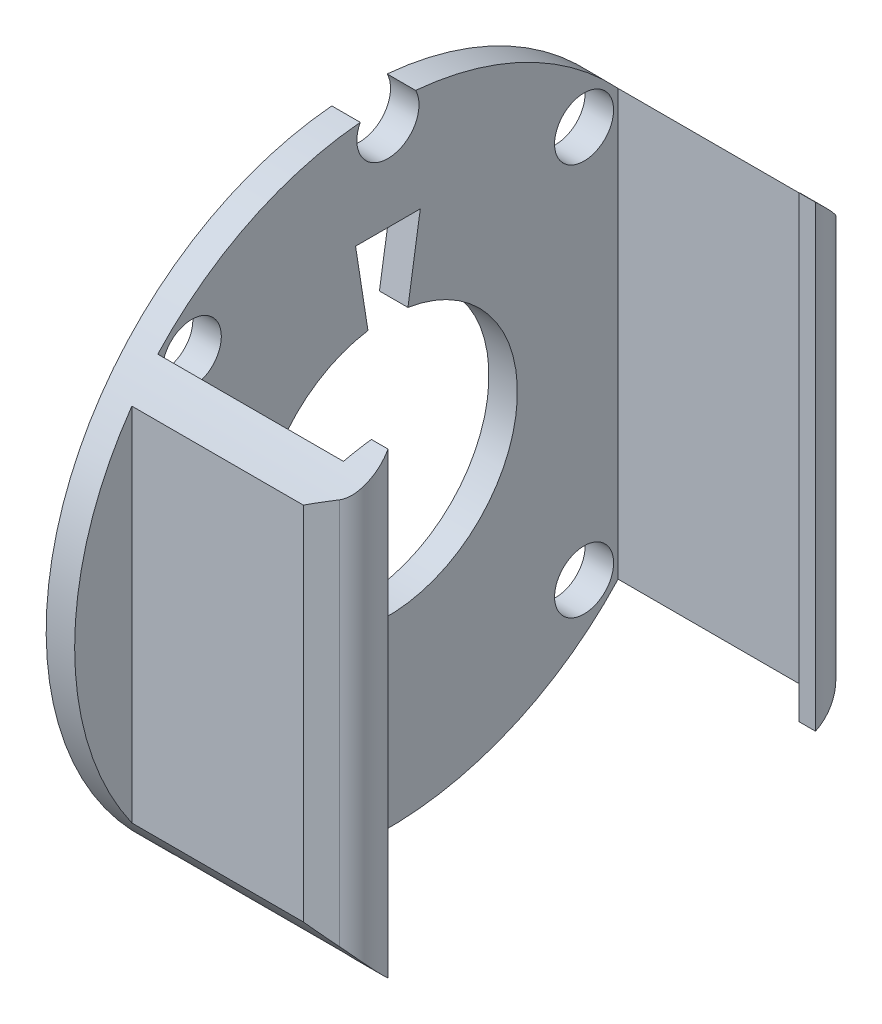
ISO-10303-21;
HEADER;
FILE_DESCRIPTION(('STEP AP214'),'2;1');
FILE_NAME('part.step','',(''),(''),'','','');
FILE_SCHEMA(('AUTOMOTIVE_DESIGN { 1 0 10303 214 1 1 1 1 }'));
ENDSEC;
DATA;
#1=APPLICATION_CONTEXT('core data for automotive mechanical design processes');
#2=APPLICATION_PROTOCOL_DEFINITION('international standard','automotive_design',2000,#1);
#3=PRODUCT_CONTEXT('',#1,'mechanical');
#4=PRODUCT('Part','Part','',(#3));
#5=PRODUCT_RELATED_PRODUCT_CATEGORY('part','',(#4));
#6=PRODUCT_DEFINITION_FORMATION('','',#4);
#7=PRODUCT_DEFINITION_CONTEXT('part definition',#1,'design');
#8=PRODUCT_DEFINITION('design','',#6,#7);
#9=PRODUCT_DEFINITION_SHAPE('','',#8);
#10=(LENGTH_UNIT() NAMED_UNIT(*) SI_UNIT(.MILLI.,.METRE.));
#11=(NAMED_UNIT(*) PLANE_ANGLE_UNIT() SI_UNIT($,.RADIAN.));
#12=(NAMED_UNIT(*) SI_UNIT($,.STERADIAN.) SOLID_ANGLE_UNIT());
#13=UNCERTAINTY_MEASURE_WITH_UNIT(LENGTH_MEASURE(1.E-05),#10,'distance_accuracy_value','');
#14=(GEOMETRIC_REPRESENTATION_CONTEXT(3) GLOBAL_UNCERTAINTY_ASSIGNED_CONTEXT((#13)) GLOBAL_UNIT_ASSIGNED_CONTEXT((#10,
#11,#12)) REPRESENTATION_CONTEXT('',''));
#15=CARTESIAN_POINT('',(0.,0.,0.));
#16=DIRECTION('',(0.,0.,1.));
#17=DIRECTION('',(1.,0.,0.));
#18=AXIS2_PLACEMENT_3D('',#15,#16,#17);
#19=CARTESIAN_POINT('',(5.5,0.,0.));
#20=DIRECTION('',(1.,0.,0.));
#21=DIRECTION('',(0.,0.,-1.));
#22=AXIS2_PLACEMENT_3D('',#19,#20,#21);
#23=PLANE('',#22);
#24=CARTESIAN_POINT('',(5.5,57.537769206043,0.));
#25=DIRECTION('',(1.,0.,0.));
#26=DIRECTION('',(0.,0.,-1.));
#27=AXIS2_PLACEMENT_3D('',#24,#25,#26);
#28=CIRCLE('',#27,6.);
#29=CARTESIAN_POINT('',(5.5,60.2634146309545,5.34517137402148));
#30=VERTEX_POINT('',#29);
#31=CARTESIAN_POINT('',(5.5,60.2634146309545,-5.34517137402148));
#32=VERTEX_POINT('',#31);
#33=EDGE_CURVE('E194',#30,#32,#28,.T.);
#34=ORIENTED_EDGE('',*,*,#33,.F.);
#35=CARTESIAN_POINT('',(5.5,0.,0.));
#36=DIRECTION('',(1.,0.,0.));
#37=DIRECTION('',(0.,0.,-1.));
#38=AXIS2_PLACEMENT_3D('',#35,#36,#37);
#39=CIRCLE('',#38,60.5);
#40=CARTESIAN_POINT('',(5.5,41.0420211490614,44.45));
#41=VERTEX_POINT('',#40);
#42=EDGE_CURVE('E283',#30,#41,#39,.T.);
#43=ORIENTED_EDGE('',*,*,#42,.T.);
#44=DIRECTION('',(0.,1.,0.));
#45=VECTOR('',#44,1.);
#46=CARTESIAN_POINT('',(5.5,0.,44.45));
#47=LINE('',#46,#45);
#48=CARTESIAN_POINT('',(5.5,-41.0420211490614,44.45));
#49=VERTEX_POINT('',#48);
#50=EDGE_CURVE('E222',#49,#41,#47,.T.);
#51=ORIENTED_EDGE('',*,*,#50,.F.);
#52=CARTESIAN_POINT('',(5.5,-41.0420211490614,-44.45));
#53=VERTEX_POINT('',#52);
#54=EDGE_CURVE('E282',#49,#53,#39,.T.);
#55=ORIENTED_EDGE('',*,*,#54,.T.);
#56=DIRECTION('',(0.,1.,0.));
#57=VECTOR('',#56,1.);
#58=CARTESIAN_POINT('',(5.5,0.,-44.45));
#59=LINE('',#58,#57);
#60=CARTESIAN_POINT('',(5.5,41.0420211490614,-44.45));
#61=VERTEX_POINT('',#60);
#62=EDGE_CURVE('E241',#53,#61,#59,.T.);
#63=ORIENTED_EDGE('',*,*,#62,.T.);
#64=EDGE_CURVE('E284',#61,#32,#39,.T.);
#65=ORIENTED_EDGE('',*,*,#64,.T.);
#66=EDGE_LOOP('',(#34,#43,#51,#55,#63,#65));
#67=FACE_BOUND('',#66,.T.);
#68=CARTESIAN_POINT('',(5.5,-37.875,37.875));
#69=DIRECTION('',(1.,0.,0.));
#70=DIRECTION('',(0.,0.,1.));
#71=AXIS2_PLACEMENT_3D('',#68,#69,#70);
#72=CIRCLE('',#71,5.69999999999999);
#73=CARTESIAN_POINT('',(5.5,-37.875,43.575));
#74=VERTEX_POINT('',#73);
#75=EDGE_CURVE('E264',#74,#74,#72,.T.);
#76=ORIENTED_EDGE('',*,*,#75,.F.);
#77=EDGE_LOOP('',(#76));
#78=FACE_BOUND('',#77,.T.);
#79=CARTESIAN_POINT('',(5.5,-37.875,-37.875));
#80=DIRECTION('',(1.,0.,0.));
#81=DIRECTION('',(0.,0.,-1.));
#82=AXIS2_PLACEMENT_3D('',#79,#80,#81);
#83=CIRCLE('',#82,5.69999999999999);
#84=CARTESIAN_POINT('',(5.5,-37.875,-43.575));
#85=VERTEX_POINT('',#84);
#86=EDGE_CURVE('E258',#85,#85,#83,.T.);
#87=ORIENTED_EDGE('',*,*,#86,.F.);
#88=EDGE_LOOP('',(#87));
#89=FACE_BOUND('',#88,.T.);
#90=CARTESIAN_POINT('',(5.5,37.875,-37.875));
#91=DIRECTION('',(1.,0.,0.));
#92=DIRECTION('',(0.,0.,1.));
#93=AXIS2_PLACEMENT_3D('',#90,#91,#92);
#94=CIRCLE('',#93,5.7);
#95=CARTESIAN_POINT('',(5.5,37.875,-32.175));
#96=VERTEX_POINT('',#95);
#97=EDGE_CURVE('E251',#96,#96,#94,.T.);
#98=ORIENTED_EDGE('',*,*,#97,.F.);
#99=EDGE_LOOP('',(#98));
#100=FACE_BOUND('',#99,.T.);
#101=CARTESIAN_POINT('',(5.5,37.875,37.875));
#102=DIRECTION('',(1.,0.,0.));
#103=DIRECTION('',(0.,0.,-1.));
#104=AXIS2_PLACEMENT_3D('',#101,#102,#103);
#105=CIRCLE('',#104,5.7);
#106=CARTESIAN_POINT('',(5.5,37.875,32.175));
#107=VERTEX_POINT('',#106);
#108=EDGE_CURVE('E254',#107,#107,#105,.T.);
#109=ORIENTED_EDGE('',*,*,#108,.F.);
#110=EDGE_LOOP('',(#109));
#111=FACE_BOUND('',#110,.T.);
#112=DIRECTION('',(0.,0.,-1.));
#113=VECTOR('',#112,1.);
#114=CARTESIAN_POINT('',(5.5,40.,6.25));
#115=LINE('',#114,#113);
#116=CARTESIAN_POINT('',(5.5,40.,6.25));
#117=VERTEX_POINT('',#116);
#118=CARTESIAN_POINT('',(5.5,40.,-6.25));
#119=VERTEX_POINT('',#118);
#120=EDGE_CURVE('E189',#117,#119,#115,.T.);
#121=ORIENTED_EDGE('',*,*,#120,.T.);
#122=DIRECTION('',(0.,-0.988012033751101,0.15437688027361));
#123=VECTOR('',#122,1.);
#124=CARTESIAN_POINT('',(5.5,40.,-6.25));
#125=LINE('',#124,#123);
#126=CARTESIAN_POINT('',(5.5,24.7003008437775,-3.85942200684024));
#127=VERTEX_POINT('',#126);
#128=EDGE_CURVE('E195',#119,#127,#125,.T.);
#129=ORIENTED_EDGE('',*,*,#128,.T.);
#130=CARTESIAN_POINT('',(5.5,0.,0.));
#131=DIRECTION('',(1.,0.,0.));
#132=DIRECTION('',(0.,0.,-1.));
#133=AXIS2_PLACEMENT_3D('',#130,#131,#132);
#134=CIRCLE('',#133,25.);
#135=CARTESIAN_POINT('',(5.5,24.7003008437775,3.85942200684024));
#136=VERTEX_POINT('',#135);
#137=EDGE_CURVE('E199',#136,#127,#134,.T.);
#138=ORIENTED_EDGE('',*,*,#137,.F.);
#139=DIRECTION('',(0.,0.988012033751101,0.15437688027361));
#140=VECTOR('',#139,1.);
#141=CARTESIAN_POINT('',(5.5,0.,0.));
#142=LINE('',#141,#140);
#143=EDGE_CURVE('E66',#136,#117,#142,.T.);
#144=ORIENTED_EDGE('',*,*,#143,.T.);
#145=EDGE_LOOP('',(#121,#129,#138,#144));
#146=FACE_BOUND('',#145,.T.);
#147=ADVANCED_FACE('F43',(#67,#78,#89,#100,#111,#146),#23,.T.);
#148=CARTESIAN_POINT('',(0.,0.,0.));
#149=DIRECTION('',(1.,0.,0.));
#150=DIRECTION('',(0.,0.,-1.));
#151=AXIS2_PLACEMENT_3D('',#148,#149,#150);
#152=PLANE('',#151);
#153=CARTESIAN_POINT('',(0.,0.,0.));
#154=DIRECTION('',(1.,0.,0.));
#155=DIRECTION('',(0.,0.,-1.));
#156=AXIS2_PLACEMENT_3D('',#153,#154,#155);
#157=CIRCLE('',#156,60.5);
#158=CARTESIAN_POINT('',(0.,60.2634146309545,5.34517137402148));
#159=VERTEX_POINT('',#158);
#160=CARTESIAN_POINT('',(0.,60.2634146309545,-5.34517137402147));
#161=VERTEX_POINT('',#160);
#162=EDGE_CURVE('E276',#159,#161,#157,.T.);
#163=ORIENTED_EDGE('',*,*,#162,.F.);
#164=CARTESIAN_POINT('',(0.,57.537769206043,0.));
#165=DIRECTION('',(1.,0.,0.));
#166=DIRECTION('',(0.,0.,-1.));
#167=AXIS2_PLACEMENT_3D('',#164,#165,#166);
#168=CIRCLE('',#167,6.);
#169=EDGE_CURVE('E11',#159,#161,#168,.T.);
#170=ORIENTED_EDGE('',*,*,#169,.T.);
#171=EDGE_LOOP('',(#163,#170));
#172=FACE_BOUND('',#171,.T.);
#173=CARTESIAN_POINT('',(0.,37.875,37.875));
#174=DIRECTION('',(1.,0.,0.));
#175=DIRECTION('',(0.,0.,-1.));
#176=AXIS2_PLACEMENT_3D('',#173,#174,#175);
#177=CIRCLE('',#176,5.7);
#178=CARTESIAN_POINT('',(0.,37.875,32.175));
#179=VERTEX_POINT('',#178);
#180=EDGE_CURVE('E273',#179,#179,#177,.T.);
#181=ORIENTED_EDGE('',*,*,#180,.T.);
#182=EDGE_LOOP('',(#181));
#183=FACE_BOUND('',#182,.T.);
#184=CARTESIAN_POINT('',(0.,37.875,-37.875));
#185=DIRECTION('',(1.,0.,0.));
#186=DIRECTION('',(0.,0.,1.));
#187=AXIS2_PLACEMENT_3D('',#184,#185,#186);
#188=CIRCLE('',#187,5.7);
#189=CARTESIAN_POINT('',(0.,37.875,-32.175));
#190=VERTEX_POINT('',#189);
#191=EDGE_CURVE('E255',#190,#190,#188,.T.);
#192=ORIENTED_EDGE('',*,*,#191,.T.);
#193=EDGE_LOOP('',(#192));
#194=FACE_BOUND('',#193,.T.);
#195=CARTESIAN_POINT('',(0.,-37.875,-37.875));
#196=DIRECTION('',(1.,0.,0.));
#197=DIRECTION('',(0.,0.,-1.));
#198=AXIS2_PLACEMENT_3D('',#195,#196,#197);
#199=CIRCLE('',#198,5.69999999999999);
#200=CARTESIAN_POINT('',(0.,-37.875,-43.575));
#201=VERTEX_POINT('',#200);
#202=EDGE_CURVE('E261',#201,#201,#199,.T.);
#203=ORIENTED_EDGE('',*,*,#202,.T.);
#204=EDGE_LOOP('',(#203));
#205=FACE_BOUND('',#204,.T.);
#206=CARTESIAN_POINT('',(0.,-37.875,37.875));
#207=DIRECTION('',(1.,0.,0.));
#208=DIRECTION('',(0.,0.,1.));
#209=AXIS2_PLACEMENT_3D('',#206,#207,#208);
#210=CIRCLE('',#209,5.69999999999999);
#211=CARTESIAN_POINT('',(0.,-37.875,43.575));
#212=VERTEX_POINT('',#211);
#213=EDGE_CURVE('E267',#212,#212,#210,.T.);
#214=ORIENTED_EDGE('',*,*,#213,.T.);
#215=EDGE_LOOP('',(#214));
#216=FACE_BOUND('',#215,.T.);
#217=DIRECTION('',(0.,-0.988012033751101,0.15437688027361));
#218=VECTOR('',#217,1.);
#219=CARTESIAN_POINT('',(0.,40.,-6.25));
#220=LINE('',#219,#218);
#221=CARTESIAN_POINT('',(0.,40.,-6.25));
#222=VERTEX_POINT('',#221);
#223=CARTESIAN_POINT('',(0.,24.7003008437775,-3.85942200684024));
#224=VERTEX_POINT('',#223);
#225=EDGE_CURVE('E203',#222,#224,#220,.T.);
#226=ORIENTED_EDGE('',*,*,#225,.F.);
#227=DIRECTION('',(0.,0.,-1.));
#228=VECTOR('',#227,1.);
#229=CARTESIAN_POINT('',(0.,40.,6.25));
#230=LINE('',#229,#228);
#231=CARTESIAN_POINT('',(0.,40.,6.25));
#232=VERTEX_POINT('',#231);
#233=EDGE_CURVE('E200',#232,#222,#230,.T.);
#234=ORIENTED_EDGE('',*,*,#233,.F.);
#235=DIRECTION('',(0.,0.988012033751101,0.15437688027361));
#236=VECTOR('',#235,1.);
#237=CARTESIAN_POINT('',(0.,0.,0.));
#238=LINE('',#237,#236);
#239=CARTESIAN_POINT('',(0.,24.7003008437775,3.85942200684024));
#240=VERTEX_POINT('',#239);
#241=EDGE_CURVE('E182',#240,#232,#238,.T.);
#242=ORIENTED_EDGE('',*,*,#241,.F.);
#243=CARTESIAN_POINT('',(0.,0.,0.));
#244=DIRECTION('',(1.,0.,0.));
#245=DIRECTION('',(0.,0.,-1.));
#246=AXIS2_PLACEMENT_3D('',#243,#244,#245);
#247=CIRCLE('',#246,25.);
#248=EDGE_CURVE('E238',#240,#224,#247,.T.);
#249=ORIENTED_EDGE('',*,*,#248,.T.);
#250=EDGE_LOOP('',(#226,#234,#242,#249));
#251=FACE_BOUND('',#250,.T.);
#252=ADVANCED_FACE('F334',(#172,#183,#194,#205,#216,#251),#152,.F.);
#253=CARTESIAN_POINT('',(0.,0.,0.));
#254=DIRECTION('',(1.,0.,0.));
#255=DIRECTION('',(0.,0.,-1.));
#256=AXIS2_PLACEMENT_3D('',#253,#254,#255);
#257=CYLINDRICAL_SURFACE('',#256,25.);
#258=DIRECTION('',(1.,0.,0.));
#259=VECTOR('',#258,1.);
#260=CARTESIAN_POINT('',(0.,24.7003008437775,-3.85942200684024));
#261=LINE('',#260,#259);
#262=EDGE_CURVE('E52',#224,#127,#261,.T.);
#263=ORIENTED_EDGE('',*,*,#262,.F.);
#264=ORIENTED_EDGE('',*,*,#248,.F.);
#265=DIRECTION('',(1.,0.,0.));
#266=VECTOR('',#265,1.);
#267=CARTESIAN_POINT('',(0.,24.7003008437775,3.85942200684024));
#268=LINE('',#267,#266);
#269=EDGE_CURVE('E476',#136,#240,#268,.F.);
#270=ORIENTED_EDGE('',*,*,#269,.F.);
#271=ORIENTED_EDGE('',*,*,#137,.T.);
#272=EDGE_LOOP('',(#263,#264,#270,#271));
#273=FACE_BOUND('',#272,.T.);
#274=ADVANCED_FACE('F379',(#273),#257,.F.);
#275=DIRECTION('',(0.,-1.,0.));
#276=VECTOR('',#275,1.);
#277=CARTESIAN_POINT('',(5.5,0.,49.45));
#278=LINE('',#277,#276);
#279=CARTESIAN_POINT('',(5.5,34.8560970276364,49.45));
#280=VERTEX_POINT('',#279);
#281=CARTESIAN_POINT('',(5.5,-34.8560970276364,49.45));
#282=VERTEX_POINT('',#281);
#283=EDGE_CURVE('E225',#280,#282,#278,.T.);
#284=ORIENTED_EDGE('',*,*,#283,.F.);
#285=EDGE_CURVE('E397',#280,#282,#39,.T.);
#286=ORIENTED_EDGE('',*,*,#285,.T.);
#287=EDGE_LOOP('',(#284,#286));
#288=FACE_BOUND('',#287,.T.);
#289=ADVANCED_FACE('F374',(#288),#23,.T.);
#290=CARTESIAN_POINT('',(5.5,-34.8560970276363,-49.45));
#291=VERTEX_POINT('',#290);
#292=CARTESIAN_POINT('',(5.5,34.8560970276363,-49.45));
#293=VERTEX_POINT('',#292);
#294=EDGE_CURVE('E279',#291,#293,#39,.T.);
#295=ORIENTED_EDGE('',*,*,#294,.T.);
#296=DIRECTION('',(0.,-1.,0.));
#297=VECTOR('',#296,1.);
#298=CARTESIAN_POINT('',(5.5,0.,-49.45));
#299=LINE('',#298,#297);
#300=EDGE_CURVE('E219',#293,#291,#299,.T.);
#301=ORIENTED_EDGE('',*,*,#300,.T.);
#302=EDGE_LOOP('',(#295,#301));
#303=FACE_BOUND('',#302,.T.);
#304=ADVANCED_FACE('F332',(#303),#23,.T.);
#305=CARTESIAN_POINT('',(5.5,0.,0.));
#306=DIRECTION('',(-1.,0.,0.));
#307=DIRECTION('',(0.,0.,1.));
#308=AXIS2_PLACEMENT_3D('',#305,#306,#307);
#309=CYLINDRICAL_SURFACE('',#308,60.5);
#310=ORIENTED_EDGE('',*,*,#162,.T.);
#311=DIRECTION('',(1.,0.,0.));
#312=VECTOR('',#311,1.);
#313=CARTESIAN_POINT('',(2.75,60.2634146309545,-5.34517137402148));
#314=LINE('',#313,#312);
#315=EDGE_CURVE('E59',#161,#32,#314,.T.);
#316=ORIENTED_EDGE('',*,*,#315,.T.);
#317=ORIENTED_EDGE('',*,*,#64,.F.);
#318=DIRECTION('',(-1.,0.,0.));
#319=VECTOR('',#318,1.);
#320=CARTESIAN_POINT('',(43.6,41.0420211490614,-44.45));
#321=LINE('',#320,#319);
#322=CARTESIAN_POINT('',(41.35,41.0420211490614,-44.45));
#323=VERTEX_POINT('',#322);
#324=EDGE_CURVE('E248',#323,#61,#321,.T.);
#325=ORIENTED_EDGE('',*,*,#324,.F.);
#326=CARTESIAN_POINT('',(72.4742250734213,0.,0.));
#327=DIRECTION('',(0.819152044288994,0.,-0.573576436351042));
#328=DIRECTION('',(-0.573576436351042,0.,-0.819152044288995));
#329=AXIS2_PLACEMENT_3D('',#326,#327,#328);
#330=ELLIPSE('',#329,73.8568626200679,60.5);
#331=CARTESIAN_POINT('',(43.5731589338158,44.2337470151467,-41.275));
#332=VERTEX_POINT('',#331);
#333=EDGE_CURVE('E484',#323,#332,#330,.T.);
#334=ORIENTED_EDGE('',*,*,#333,.T.);
#335=DIRECTION('',(-1.,0.,0.));
#336=VECTOR('',#335,1.);
#337=CARTESIAN_POINT('',(48.6,44.2337470151467,-41.275));
#338=LINE('',#337,#336);
#339=CARTESIAN_POINT('',(46.7801488286689,44.2337470151467,-41.275));
#340=VERTEX_POINT('',#339);
#341=EDGE_CURVE('E217',#340,#332,#338,.T.);
#342=ORIENTED_EDGE('',*,*,#341,.F.);
#343=CARTESIAN_POINT('',(46.7801488286689,44.2337470151467,-41.275));
#344=CARTESIAN_POINT('',(46.811431664512,44.1473642728017,-41.36757613797));
#345=CARTESIAN_POINT('',(46.8397794482952,44.060212655303,-41.460391117105));
#346=CARTESIAN_POINT('',(46.8907635801429,43.8845523253074,-41.6462771623468));
#347=CARTESIAN_POINT('',(46.9134008689116,43.7960438388824,-41.7393481837182));
#348=CARTESIAN_POINT('',(46.9729576302748,43.5288959255708,-42.01846558931));
#349=CARTESIAN_POINT('',(47.0015862729972,43.3484539599077,-42.2046094252791));
#350=CARTESIAN_POINT('',(47.0377614972247,42.9845461439172,-42.5751823480388));
#351=CARTESIAN_POINT('',(47.0453486495224,42.8010867998734,-42.7596140504081));
#352=CARTESIAN_POINT('',(47.0404417945932,42.4318970109322,-43.1259986603806));
#353=CARTESIAN_POINT('',(47.0279427945764,42.2461660127616,-43.3079509403385));
#354=CARTESIAN_POINT('',(46.9831932299238,41.8711615095381,-43.670639655873));
#355=CARTESIAN_POINT('',(46.950687155881,41.6818733971754,-43.8513292745621));
#356=CARTESIAN_POINT('',(46.8660750257247,41.3033087322041,-44.2080799157887));
#357=CARTESIAN_POINT('',(46.8139686878213,41.1140321798006,-44.3841408717417));
#358=CARTESIAN_POINT('',(46.6900815254511,40.7363315496115,-44.7310540037615));
#359=CARTESIAN_POINT('',(46.6182577641092,40.5479102551567,-44.901893897544));
#360=CARTESIAN_POINT('',(46.4547045078253,40.1738160701705,-45.2369040702822));
#361=CARTESIAN_POINT('',(46.3629797078261,39.9881425424184,-45.4010759115015));
#362=CARTESIAN_POINT('',(46.1852478374541,39.6686448538441,-45.6802071850913));
#363=CARTESIAN_POINT('',(46.1038610914026,39.5337920954811,-45.7969440712594));
#364=CARTESIAN_POINT('',(45.9292937288964,39.2675270969947,-46.0254502208166));
#365=CARTESIAN_POINT('',(45.8361139271913,39.1361146199478,-46.1372198266613));
#366=CARTESIAN_POINT('',(45.6379733099256,38.8786782893775,-46.3543586455131));
#367=CARTESIAN_POINT('',(45.5330852987175,38.752627201719,-46.4597617509584));
#368=CARTESIAN_POINT('',(45.310382723948,38.50659507419,-46.6638795724443));
#369=CARTESIAN_POINT('',(45.1925692336506,38.3866135315434,-46.7625948427084));
#370=CARTESIAN_POINT('',(44.9749467556618,38.1842035066926,-46.9279137935616));
#371=CARTESIAN_POINT('',(44.8781663526854,38.0999777646369,-46.9963047271517));
#372=CARTESIAN_POINT('',(44.6767567532757,37.9371451959047,-47.1278469656937));
#373=CARTESIAN_POINT('',(44.5721335680736,37.8585341541983,-47.191002206997));
#374=CARTESIAN_POINT('',(44.3535739271017,37.707349867527,-47.3118928410169));
#375=CARTESIAN_POINT('',(44.2395504402596,37.6348495274805,-47.3695636244601));
#376=CARTESIAN_POINT('',(44.0029037037153,37.4983542131956,-47.4776909289873));
#377=CARTESIAN_POINT('',(43.8802607937581,37.4343797152866,-47.5281301033205));
#378=CARTESIAN_POINT('',(43.7534444547026,37.3756072350081,-47.5742996145441));
#379=B_SPLINE_CURVE_WITH_KNOTS('',3,(#343,#344,#345,#346,#347,#348,#349,#350,#351,#352,#353,
#354,#355,#356,#357,#358,#359,#360,#361,#362,#363,#364,#365,#366,#367,#368,#369,#370,#371,#372,
#373,#374,#375,#376,#377,#378),.UNSPECIFIED.,.F.,.F.,(4,2,2,2,2,2,2,2,2,2,2,2,2,2,2,2,2,4),(0.,
0.391197631116682,0.782330777119195,1.56378466627726,2.34373075733176,3.12387074861137,
3.9141867514859,4.70451411704,5.49657634978544,6.28845192637686,6.87621535669199,
7.46393820220341,8.04819107462644,8.63239547041862,9.06819975893086,9.50367336771258,
9.94376703980922,10.3848993264154),.UNSPECIFIED.);
#380=CARTESIAN_POINT('',(43.7534444547026,37.3756072350081,-47.574299614544));
#381=VERTEX_POINT('',#380);
#382=EDGE_CURVE('E343',#340,#381,#379,.T.);
#383=ORIENTED_EDGE('',*,*,#382,.T.);
#384=CARTESIAN_POINT('',(174.462758392033,0.,0.));
#385=DIRECTION('',(-0.342020143325665,0.,0.93969262078591));
#386=DIRECTION('',(-0.93969262078591,0.,-0.342020143325665));
#387=AXIS2_PLACEMENT_3D('',#384,#385,#386);
#388=ELLIPSE('',#387,176.890166209869,60.5);
#389=CARTESIAN_POINT('',(38.5999999999999,34.8560970276363,-49.45));
#390=VERTEX_POINT('',#389);
#391=EDGE_CURVE('E297',#381,#390,#388,.T.);
#392=ORIENTED_EDGE('',*,*,#391,.T.);
#393=DIRECTION('',(-1.,0.,0.));
#394=VECTOR('',#393,1.);
#395=CARTESIAN_POINT('',(43.6,34.8560970276363,-49.45));
#396=LINE('',#395,#394);
#397=EDGE_CURVE('E226',#390,#293,#396,.T.);
#398=ORIENTED_EDGE('',*,*,#397,.T.);
#399=ORIENTED_EDGE('',*,*,#294,.F.);
#400=DIRECTION('',(-1.,0.,0.));
#401=VECTOR('',#400,1.);
#402=CARTESIAN_POINT('',(43.6,-34.8560970276363,-49.45));
#403=LINE('',#402,#401);
#404=CARTESIAN_POINT('',(38.5999999999999,-34.8560970276363,-49.45));
#405=VERTEX_POINT('',#404);
#406=EDGE_CURVE('E244',#405,#291,#403,.T.);
#407=ORIENTED_EDGE('',*,*,#406,.F.);
#408=CARTESIAN_POINT('',(174.462758392033,0.,0.));
#409=DIRECTION('',(-0.342020143325665,0.,0.93969262078591));
#410=DIRECTION('',(-0.93969262078591,0.,-0.342020143325665));
#411=AXIS2_PLACEMENT_3D('',#408,#409,#410);
#412=ELLIPSE('',#411,176.890166209869,60.5);
#413=CARTESIAN_POINT('',(43.7534444547026,-37.3756072350081,-47.574299614544));
#414=VERTEX_POINT('',#413);
#415=EDGE_CURVE('E299',#405,#414,#412,.T.);
#416=ORIENTED_EDGE('',*,*,#415,.T.);
#417=CARTESIAN_POINT('',(43.7534444547026,-37.3756072350081,-47.574299614544));
#418=CARTESIAN_POINT('',(43.889923505242,-37.4388654468986,-47.5246073360812));
#419=CARTESIAN_POINT('',(44.0215506757995,-37.5081279978974,-47.4699847416232));
#420=CARTESIAN_POINT('',(44.2747640560779,-37.6563750870756,-47.3524676463672));
#421=CARTESIAN_POINT('',(44.3963773344785,-37.7353318759429,-47.2895967221917));
#422=CARTESIAN_POINT('',(44.6286058821825,-37.9000766783104,-47.1576635528725));
#423=CARTESIAN_POINT('',(44.7393343516108,-37.9857727070693,-47.0886834569638));
#424=CARTESIAN_POINT('',(44.9518322423664,-38.1633425568215,-46.9448863176308));
#425=CARTESIAN_POINT('',(45.0535934514937,-38.2552219074534,-46.8700640398016));
#426=CARTESIAN_POINT('',(45.286403221248,-38.480594168138,-46.6853567538124));
#427=CARTESIAN_POINT('',(45.4134247027635,-38.6163587474796,-46.5731643923107));
#428=CARTESIAN_POINT('',(45.6517554981118,-38.8947140164352,-46.3409550891008));
#429=CARTESIAN_POINT('',(45.7630626806029,-39.0373056284994,-46.2209370892164));
#430=CARTESIAN_POINT('',(45.9716162546737,-39.3285020203318,-45.973423873811));
#431=CARTESIAN_POINT('',(46.0687552614366,-39.4771427981565,-45.8458809058103));
#432=CARTESIAN_POINT('',(46.2487040311334,-39.7780023256746,-45.5850874331723));
#433=CARTESIAN_POINT('',(46.33151318153,-39.930221228001,-45.4518366848565));
#434=CARTESIAN_POINT('',(46.5066209873303,-40.2842481047276,-45.1386861883202));
#435=CARTESIAN_POINT('',(46.5940258243331,-40.4869308807327,-44.9570260022937));
#436=CARTESIAN_POINT('',(46.7458191273765,-40.8944861871335,-44.5866223266682));
#437=CARTESIAN_POINT('',(46.8102007370674,-41.0993593511539,-44.3978767454884));
#438=CARTESIAN_POINT('',(46.9158217380793,-41.5088898080989,-44.0152284580635));
#439=CARTESIAN_POINT('',(46.9571393530834,-41.7135454518727,-43.821345548649));
#440=CARTESIAN_POINT('',(47.0166017281338,-42.1218192319555,-43.4290506014704));
#441=CARTESIAN_POINT('',(47.0347526646543,-42.3254376303794,-43.2306397852582));
#442=CARTESIAN_POINT('',(47.0454224588187,-42.6740275095657,-42.8861246702269));
#443=CARTESIAN_POINT('',(47.0436555895309,-42.8195967409036,-42.740780867436));
#444=CARTESIAN_POINT('',(47.0272342062991,-43.1088525248288,-42.4490166836321));
#445=CARTESIAN_POINT('',(47.0125837301394,-43.2525396529585,-42.3025966541696));
#446=CARTESIAN_POINT('',(46.9698825202898,-43.5376648529422,-42.0090893787547));
#447=CARTESIAN_POINT('',(46.9418129316079,-43.6790994699977,-41.8620014833199));
#448=CARTESIAN_POINT('',(46.871652666234,-43.9589145747293,-41.5680799900434));
#449=CARTESIAN_POINT('',(46.8295524188804,-44.0972929087497,-41.4212466347412));
#450=CARTESIAN_POINT('',(46.7801488286689,-44.2337470151467,-41.275));
#451=B_SPLINE_CURVE_WITH_KNOTS('',3,(#417,#418,#419,#420,#421,#422,#423,#424,#425,#426,#427,
#428,#429,#430,#431,#432,#433,#434,#435,#436,#437,#438,#439,#440,#441,#442,#443,#444,#445,#446,
#447,#448,#449,#450),.UNSPECIFIED.,.F.,.F.,(4,2,2,2,2,2,2,2,2,2,2,2,2,2,2,2,4),(0.,
0.474660894775993,0.947993456008071,1.41571988640292,1.88387030226639,2.53433049661261,
3.18487882876655,3.84012676222456,4.49540269768452,5.35188663545866,6.20862542337624,
7.06244056766127,7.91602802848222,8.53279397349519,9.14936668996013,9.76680830112969,
10.3846719495918),.UNSPECIFIED.);
#452=CARTESIAN_POINT('',(46.7801488286689,-44.2337470151467,-41.275));
#453=VERTEX_POINT('',#452);
#454=EDGE_CURVE('E348',#414,#453,#451,.T.);
#455=ORIENTED_EDGE('',*,*,#454,.T.);
#456=DIRECTION('',(-1.,0.,0.));
#457=VECTOR('',#456,1.);
#458=CARTESIAN_POINT('',(48.6,-44.2337470151467,-41.275));
#459=LINE('',#458,#457);
#460=CARTESIAN_POINT('',(43.5731589338158,-44.2337470151467,-41.275));
#461=VERTEX_POINT('',#460);
#462=EDGE_CURVE('E213',#453,#461,#459,.T.);
#463=ORIENTED_EDGE('',*,*,#462,.T.);
#464=CARTESIAN_POINT('',(72.4742250734213,0.,0.));
#465=DIRECTION('',(0.819152044288994,0.,-0.573576436351042));
#466=DIRECTION('',(-0.573576436351042,0.,-0.819152044288995));
#467=AXIS2_PLACEMENT_3D('',#464,#465,#466);
#468=ELLIPSE('',#467,73.8568626200679,60.5);
#469=CARTESIAN_POINT('',(41.35,-41.0420211490614,-44.45));
#470=VERTEX_POINT('',#469);
#471=EDGE_CURVE('E477',#461,#470,#468,.T.);
#472=ORIENTED_EDGE('',*,*,#471,.T.);
#473=DIRECTION('',(-1.,0.,0.));
#474=VECTOR('',#473,1.);
#475=CARTESIAN_POINT('',(43.6,-41.0420211490614,-44.45));
#476=LINE('',#475,#474);
#477=EDGE_CURVE('E246',#470,#53,#476,.T.);
#478=ORIENTED_EDGE('',*,*,#477,.T.);
#479=ORIENTED_EDGE('',*,*,#54,.F.);
#480=DIRECTION('',(-1.,0.,0.));
#481=VECTOR('',#480,1.);
#482=CARTESIAN_POINT('',(43.6,-41.0420211490614,44.45));
#483=LINE('',#482,#481);
#484=CARTESIAN_POINT('',(41.35,-41.0420211490614,44.45));
#485=VERTEX_POINT('',#484);
#486=EDGE_CURVE('E236',#485,#49,#483,.T.);
#487=ORIENTED_EDGE('',*,*,#486,.F.);
#488=CARTESIAN_POINT('',(72.4742250734213,0.,0.));
#489=DIRECTION('',(-0.819152044288994,0.,-0.573576436351042));
#490=DIRECTION('',(-0.573576436351042,0.,0.819152044288995));
#491=AXIS2_PLACEMENT_3D('',#488,#489,#490);
#492=ELLIPSE('',#491,73.8568626200679,60.5);
#493=CARTESIAN_POINT('',(43.5731589338158,-44.2337470151467,41.275));
#494=VERTEX_POINT('',#493);
#495=EDGE_CURVE('E489',#485,#494,#492,.F.);
#496=ORIENTED_EDGE('',*,*,#495,.T.);
#497=DIRECTION('',(-1.,0.,0.));
#498=VECTOR('',#497,1.);
#499=CARTESIAN_POINT('',(48.6,-44.2337470151467,41.275));
#500=LINE('',#499,#498);
#501=CARTESIAN_POINT('',(46.7801488286689,-44.2337470151467,41.275));
#502=VERTEX_POINT('',#501);
#503=EDGE_CURVE('E214',#502,#494,#500,.T.);
#504=ORIENTED_EDGE('',*,*,#503,.F.);
#505=CARTESIAN_POINT('',(46.7801488286689,-44.2337470151467,41.275));
#506=CARTESIAN_POINT('',(46.811431664512,-44.1473642728018,41.36757613797));
#507=CARTESIAN_POINT('',(46.8397794482952,-44.0602126553031,41.4603911171049));
#508=CARTESIAN_POINT('',(46.8907635801429,-43.8845523253075,41.6462771623467));
#509=CARTESIAN_POINT('',(46.9134008689116,-43.7960438388825,41.7393481837182));
#510=CARTESIAN_POINT('',(46.9729576302748,-43.5288959255708,42.01846558931));
#511=CARTESIAN_POINT('',(47.0015862729972,-43.3484539599078,42.204609425279));
#512=CARTESIAN_POINT('',(47.0377614972247,-42.9845461439172,42.5751823480387));
#513=CARTESIAN_POINT('',(47.0453486495224,-42.8010867998734,42.7596140504081));
#514=CARTESIAN_POINT('',(47.0404417945932,-42.4318970109323,43.1259986603805));
#515=CARTESIAN_POINT('',(47.0279427945764,-42.2461660127616,43.3079509403384));
#516=CARTESIAN_POINT('',(46.9831932299237,-41.8711615095381,43.670639655873));
#517=CARTESIAN_POINT('',(46.950687155881,-41.6818733971755,43.8513292745621));
#518=CARTESIAN_POINT('',(46.8660750257247,-41.3033087322041,44.2080799157887));
#519=CARTESIAN_POINT('',(46.8139686878213,-41.1140321798007,44.3841408717417));
#520=CARTESIAN_POINT('',(46.6900815254511,-40.7363315496115,44.7310540037615));
#521=CARTESIAN_POINT('',(46.6182577641092,-40.5479102551567,44.901893897544));
#522=CARTESIAN_POINT('',(46.4547045078252,-40.1738160701705,45.2369040702822));
#523=CARTESIAN_POINT('',(46.362979707826,-39.9881425424184,45.4010759115014));
#524=CARTESIAN_POINT('',(46.1852478374541,-39.6686448538441,45.6802071850913));
#525=CARTESIAN_POINT('',(46.1038610914026,-39.5337920954812,45.7969440712593));
#526=CARTESIAN_POINT('',(45.9292937288964,-39.2675270969947,46.0254502208166));
#527=CARTESIAN_POINT('',(45.8361139271913,-39.1361146199479,46.1372198266613));
#528=CARTESIAN_POINT('',(45.6379733099256,-38.8786782893775,46.3543586455131));
#529=CARTESIAN_POINT('',(45.5330852987175,-38.752627201719,46.4597617509584));
#530=CARTESIAN_POINT('',(45.310382723948,-38.5065950741901,46.6638795724443));
#531=CARTESIAN_POINT('',(45.1925692336505,-38.3866135315434,46.7625948427083));
#532=CARTESIAN_POINT('',(44.9749467556618,-38.1842035066927,46.9279137935616));
#533=CARTESIAN_POINT('',(44.8781663526854,-38.099977764637,46.9963047271516));
#534=CARTESIAN_POINT('',(44.6767567532757,-37.9371451959047,47.1278469656936));
#535=CARTESIAN_POINT('',(44.5721335680736,-37.8585341541983,47.1910022069969));
#536=CARTESIAN_POINT('',(44.3535739271017,-37.7073498675271,47.3118928410168));
#537=CARTESIAN_POINT('',(44.2395504402596,-37.6348495274806,47.36956362446));
#538=CARTESIAN_POINT('',(44.0029037037153,-37.4983542131957,47.4776909289873));
#539=CARTESIAN_POINT('',(43.8802607937581,-37.4343797152867,47.5281301033205));
#540=CARTESIAN_POINT('',(43.7534444547026,-37.3756072350082,47.574299614544));
#541=B_SPLINE_CURVE_WITH_KNOTS('',3,(#505,#506,#507,#508,#509,#510,#511,#512,#513,#514,#515,
#516,#517,#518,#519,#520,#521,#522,#523,#524,#525,#526,#527,#528,#529,#530,#531,#532,#533,#534,
#535,#536,#537,#538,#539,#540),.UNSPECIFIED.,.F.,.F.,(4,2,2,2,2,2,2,2,2,2,2,2,2,2,2,2,2,4),(0.,
0.391197631116669,0.782330777119182,1.56378466627726,2.34373075733175,3.12387074861137,
3.91418675148591,4.70451411704002,5.49657634978546,6.28845192637686,6.876215356692,
7.46393820220341,8.04819107462643,8.63239547041861,9.06819975893083,9.50367336771255,
9.94376703980918,10.3848993264154),.UNSPECIFIED.);
#542=CARTESIAN_POINT('',(43.7534444547026,-37.3756072350082,47.574299614544));
#543=VERTEX_POINT('',#542);
#544=EDGE_CURVE('E309',#502,#543,#541,.T.);
#545=ORIENTED_EDGE('',*,*,#544,.T.);
#546=CARTESIAN_POINT('',(174.462758392032,0.,0.));
#547=DIRECTION('',(0.342020143325666,0.,0.939692620785909));
#548=DIRECTION('',(-0.939692620785909,0.,0.342020143325666));
#549=AXIS2_PLACEMENT_3D('',#546,#547,#548);
#550=ELLIPSE('',#549,176.890166209868,60.5);
#551=CARTESIAN_POINT('',(38.5999999999999,-34.8560970276364,49.45));
#552=VERTEX_POINT('',#551);
#553=EDGE_CURVE('E290',#543,#552,#550,.F.);
#554=ORIENTED_EDGE('',*,*,#553,.T.);
#555=DIRECTION('',(-1.,0.,0.));
#556=VECTOR('',#555,1.);
#557=CARTESIAN_POINT('',(43.6,-34.8560970276364,49.45));
#558=LINE('',#557,#556);
#559=EDGE_CURVE('E229',#552,#282,#558,.T.);
#560=ORIENTED_EDGE('',*,*,#559,.T.);
#561=ORIENTED_EDGE('',*,*,#285,.F.);
#562=DIRECTION('',(-1.,0.,0.));
#563=VECTOR('',#562,1.);
#564=CARTESIAN_POINT('',(43.6,34.8560970276364,49.45));
#565=LINE('',#564,#563);
#566=CARTESIAN_POINT('',(38.5999999999999,34.8560970276364,49.45));
#567=VERTEX_POINT('',#566);
#568=EDGE_CURVE('E231',#567,#280,#565,.T.);
#569=ORIENTED_EDGE('',*,*,#568,.F.);
#570=CARTESIAN_POINT('',(174.462758392032,0.,0.));
#571=DIRECTION('',(0.342020143325666,0.,0.939692620785909));
#572=DIRECTION('',(-0.939692620785909,0.,0.342020143325666));
#573=AXIS2_PLACEMENT_3D('',#570,#571,#572);
#574=ELLIPSE('',#573,176.890166209868,60.5);
#575=CARTESIAN_POINT('',(43.7534444547026,37.3756072350082,47.574299614544));
#576=VERTEX_POINT('',#575);
#577=EDGE_CURVE('E287',#567,#576,#574,.F.);
#578=ORIENTED_EDGE('',*,*,#577,.T.);
#579=CARTESIAN_POINT('',(43.7534444547026,37.3756072350082,47.574299614544));
#580=CARTESIAN_POINT('',(43.889923505242,37.4388654468987,47.5246073360811));
#581=CARTESIAN_POINT('',(44.0215506757995,37.5081279978975,47.4699847416231));
#582=CARTESIAN_POINT('',(44.2747640560779,37.6563750870757,47.3524676463671));
#583=CARTESIAN_POINT('',(44.3963773344785,37.735331875943,47.2895967221917));
#584=CARTESIAN_POINT('',(44.6286058821825,37.9000766783105,47.1576635528724));
#585=CARTESIAN_POINT('',(44.7393343516108,37.9857727070694,47.0886834569638));
#586=CARTESIAN_POINT('',(44.9518322423664,38.1633425568215,46.9448863176307));
#587=CARTESIAN_POINT('',(45.0535934514937,38.2552219074535,46.8700640398015));
#588=CARTESIAN_POINT('',(45.286403221248,38.4805941681381,46.6853567538123));
#589=CARTESIAN_POINT('',(45.4134247027635,38.6163587474796,46.5731643923107));
#590=CARTESIAN_POINT('',(45.6517554981118,38.8947140164353,46.3409550891007));
#591=CARTESIAN_POINT('',(45.7630626806029,39.0373056284995,46.2209370892163));
#592=CARTESIAN_POINT('',(45.9716162546737,39.3285020203318,45.973423873811));
#593=CARTESIAN_POINT('',(46.0687552614366,39.4771427981566,45.8458809058103));
#594=CARTESIAN_POINT('',(46.2487040311334,39.7780023256747,45.5850874331723));
#595=CARTESIAN_POINT('',(46.33151318153,39.9302212280011,45.4518366848565));
#596=CARTESIAN_POINT('',(46.5066209873303,40.2842481047277,45.1386861883201));
#597=CARTESIAN_POINT('',(46.5940258243331,40.4869308807328,44.9570260022937));
#598=CARTESIAN_POINT('',(46.7458191273765,40.8944861871335,44.5866223266682));
#599=CARTESIAN_POINT('',(46.8102007370673,41.0993593511539,44.3978767454884));
#600=CARTESIAN_POINT('',(46.9158217380793,41.508889808099,44.0152284580635));
#601=CARTESIAN_POINT('',(46.9571393530834,41.7135454518727,43.8213455486489));
#602=CARTESIAN_POINT('',(47.0166017281338,42.1218192319556,43.4290506014704));
#603=CARTESIAN_POINT('',(47.0347526646543,42.3254376303795,43.2306397852581));
#604=CARTESIAN_POINT('',(47.0454224588187,42.6740275095658,42.8861246702268));
#605=CARTESIAN_POINT('',(47.0436555895309,42.8195967409036,42.740780867436));
#606=CARTESIAN_POINT('',(47.0272342062991,43.1088525248288,42.4490166836321));
#607=CARTESIAN_POINT('',(47.0125837301394,43.2525396529585,42.3025966541695));
#608=CARTESIAN_POINT('',(46.9698825202898,43.5376648529422,42.0090893787547));
#609=CARTESIAN_POINT('',(46.9418129316079,43.6790994699978,41.8620014833199));
#610=CARTESIAN_POINT('',(46.871652666234,43.9589145747294,41.5680799900434));
#611=CARTESIAN_POINT('',(46.8295524188804,44.0972929087498,41.4212466347412));
#612=CARTESIAN_POINT('',(46.7801488286689,44.2337470151467,41.275));
#613=B_SPLINE_CURVE_WITH_KNOTS('',3,(#579,#580,#581,#582,#583,#584,#585,#586,#587,#588,#589,
#590,#591,#592,#593,#594,#595,#596,#597,#598,#599,#600,#601,#602,#603,#604,#605,#606,#607,#608,
#609,#610,#611,#612),.UNSPECIFIED.,.F.,.F.,(4,2,2,2,2,2,2,2,2,2,2,2,2,2,2,2,4),(0.,
0.474660894775987,0.947993456008059,1.41571988640292,1.88387030226638,2.5343304966126,
3.18487882876654,3.84012676222455,4.4954026976845,5.35188663545863,6.2086254233762,
7.06244056766123,7.91602802848218,8.53279397349515,9.14936668996009,9.76680830112964,
10.3846719495918),.UNSPECIFIED.);
#614=CARTESIAN_POINT('',(46.7801488286689,44.2337470151467,41.275));
#615=VERTEX_POINT('',#614);
#616=EDGE_CURVE('E317',#576,#615,#613,.T.);
#617=ORIENTED_EDGE('',*,*,#616,.T.);
#618=DIRECTION('',(-1.,0.,0.));
#619=VECTOR('',#618,1.);
#620=CARTESIAN_POINT('',(48.6,44.2337470151467,41.275));
#621=LINE('',#620,#619);
#622=CARTESIAN_POINT('',(43.5731589338158,44.2337470151467,41.275));
#623=VERTEX_POINT('',#622);
#624=EDGE_CURVE('E216',#615,#623,#621,.T.);
#625=ORIENTED_EDGE('',*,*,#624,.T.);
#626=CARTESIAN_POINT('',(72.4742250734213,0.,0.));
#627=DIRECTION('',(-0.819152044288994,0.,-0.573576436351042));
#628=DIRECTION('',(-0.573576436351042,0.,0.819152044288995));
#629=AXIS2_PLACEMENT_3D('',#626,#627,#628);
#630=ELLIPSE('',#629,73.8568626200679,60.5);
#631=CARTESIAN_POINT('',(41.35,41.0420211490614,44.45));
#632=VERTEX_POINT('',#631);
#633=EDGE_CURVE('E492',#623,#632,#630,.F.);
#634=ORIENTED_EDGE('',*,*,#633,.T.);
#635=DIRECTION('',(-1.,0.,0.));
#636=VECTOR('',#635,1.);
#637=CARTESIAN_POINT('',(43.6,41.0420211490614,44.45));
#638=LINE('',#637,#636);
#639=EDGE_CURVE('E233',#632,#41,#638,.T.);
#640=ORIENTED_EDGE('',*,*,#639,.T.);
#641=ORIENTED_EDGE('',*,*,#42,.F.);
#642=DIRECTION('',(1.,0.,0.));
#643=VECTOR('',#642,1.);
#644=CARTESIAN_POINT('',(2.75,60.2634146309545,5.34517137402148));
#645=LINE('',#644,#643);
#646=EDGE_CURVE('E209',#30,#159,#645,.F.);
#647=ORIENTED_EDGE('',*,*,#646,.T.);
#648=EDGE_LOOP('',(#310,#316,#317,#325,#334,#342,#383,#392,#398,#399,#407,#416,#455,#463,#472,
#478,#479,#487,#496,#504,#545,#554,#560,#561,#569,#578,#617,#625,#634,#640,#641,#647));
#649=FACE_BOUND('',#648,.T.);
#650=ADVANCED_FACE('F326',(#649),#309,.T.);
#651=CARTESIAN_POINT('',(0.,37.875,37.875));
#652=DIRECTION('',(1.,0.,0.));
#653=DIRECTION('',(0.,0.,-1.));
#654=AXIS2_PLACEMENT_3D('',#651,#652,#653);
#655=CYLINDRICAL_SURFACE('',#654,5.7);
#656=ORIENTED_EDGE('',*,*,#180,.F.);
#657=EDGE_LOOP('',(#656));
#658=FACE_BOUND('',#657,.T.);
#659=ORIENTED_EDGE('',*,*,#108,.T.);
#660=EDGE_LOOP('',(#659));
#661=FACE_BOUND('',#660,.T.);
#662=ADVANCED_FACE('F331',(#658,#661),#655,.F.);
#663=CARTESIAN_POINT('',(0.,37.875,-37.875));
#664=DIRECTION('',(1.,0.,0.));
#665=DIRECTION('',(0.,0.,-1.));
#666=AXIS2_PLACEMENT_3D('',#663,#664,#665);
#667=CYLINDRICAL_SURFACE('',#666,5.7);
#668=ORIENTED_EDGE('',*,*,#191,.F.);
#669=EDGE_LOOP('',(#668));
#670=FACE_BOUND('',#669,.T.);
#671=ORIENTED_EDGE('',*,*,#97,.T.);
#672=EDGE_LOOP('',(#671));
#673=FACE_BOUND('',#672,.T.);
#674=ADVANCED_FACE('F449',(#670,#673),#667,.F.);
#675=CARTESIAN_POINT('',(0.,-37.875,-37.875));
#676=DIRECTION('',(1.,0.,0.));
#677=DIRECTION('',(0.,0.,-1.));
#678=AXIS2_PLACEMENT_3D('',#675,#676,#677);
#679=CYLINDRICAL_SURFACE('',#678,5.69999999999999);
#680=ORIENTED_EDGE('',*,*,#202,.F.);
#681=EDGE_LOOP('',(#680));
#682=FACE_BOUND('',#681,.T.);
#683=ORIENTED_EDGE('',*,*,#86,.T.);
#684=EDGE_LOOP('',(#683));
#685=FACE_BOUND('',#684,.T.);
#686=ADVANCED_FACE('F452',(#682,#685),#679,.F.);
#687=CARTESIAN_POINT('',(0.,-37.875,37.875));
#688=DIRECTION('',(1.,0.,0.));
#689=DIRECTION('',(0.,0.,-1.));
#690=AXIS2_PLACEMENT_3D('',#687,#688,#689);
#691=CYLINDRICAL_SURFACE('',#690,5.69999999999999);
#692=ORIENTED_EDGE('',*,*,#213,.F.);
#693=EDGE_LOOP('',(#692));
#694=FACE_BOUND('',#693,.T.);
#695=ORIENTED_EDGE('',*,*,#75,.T.);
#696=EDGE_LOOP('',(#695));
#697=FACE_BOUND('',#696,.T.);
#698=ADVANCED_FACE('F447',(#694,#697),#691,.F.);
#699=CARTESIAN_POINT('',(43.6,0.,-49.45));
#700=DIRECTION('',(0.,0.,-1.));
#701=DIRECTION('',(-1.,0.,0.));
#702=AXIS2_PLACEMENT_3D('',#699,#700,#701);
#703=PLANE('',#702);
#704=ORIENTED_EDGE('',*,*,#397,.F.);
#705=DIRECTION('',(0.,-1.,0.));
#706=VECTOR('',#705,1.);
#707=CARTESIAN_POINT('',(38.5999999999999,0.,-49.45));
#708=LINE('',#707,#706);
#709=EDGE_CURVE('E294',#390,#405,#708,.T.);
#710=ORIENTED_EDGE('',*,*,#709,.T.);
#711=ORIENTED_EDGE('',*,*,#406,.T.);
#712=ORIENTED_EDGE('',*,*,#300,.F.);
#713=EDGE_LOOP('',(#704,#710,#711,#712));
#714=FACE_BOUND('',#713,.T.);
#715=ADVANCED_FACE('F443',(#714),#703,.T.);
#716=CARTESIAN_POINT('',(43.6,0.,-44.45));
#717=DIRECTION('',(0.,0.,1.));
#718=DIRECTION('',(1.,0.,0.));
#719=AXIS2_PLACEMENT_3D('',#716,#717,#718);
#720=PLANE('',#719);
#721=ORIENTED_EDGE('',*,*,#477,.F.);
#722=DIRECTION('',(0.,1.,0.));
#723=VECTOR('',#722,1.);
#724=CARTESIAN_POINT('',(41.35,0.,-44.45));
#725=LINE('',#724,#723);
#726=EDGE_CURVE('E486',#470,#323,#725,.T.);
#727=ORIENTED_EDGE('',*,*,#726,.T.);
#728=ORIENTED_EDGE('',*,*,#324,.T.);
#729=ORIENTED_EDGE('',*,*,#62,.F.);
#730=EDGE_LOOP('',(#721,#727,#728,#729));
#731=FACE_BOUND('',#730,.T.);
#732=ADVANCED_FACE('F439',(#731),#720,.T.);
#733=CARTESIAN_POINT('',(43.6,0.,44.45));
#734=DIRECTION('',(0.,0.,1.));
#735=DIRECTION('',(1.,0.,0.));
#736=AXIS2_PLACEMENT_3D('',#733,#734,#735);
#737=PLANE('',#736);
#738=ORIENTED_EDGE('',*,*,#639,.F.);
#739=DIRECTION('',(0.,-1.,0.));
#740=VECTOR('',#739,1.);
#741=CARTESIAN_POINT('',(41.35,-41.0420211490614,44.45));
#742=LINE('',#741,#740);
#743=EDGE_CURVE('E497',#632,#485,#742,.T.);
#744=ORIENTED_EDGE('',*,*,#743,.T.);
#745=ORIENTED_EDGE('',*,*,#486,.T.);
#746=ORIENTED_EDGE('',*,*,#50,.T.);
#747=EDGE_LOOP('',(#738,#744,#745,#746));
#748=FACE_BOUND('',#747,.T.);
#749=ADVANCED_FACE('F436',(#748),#737,.F.);
#750=CARTESIAN_POINT('',(43.6,0.,49.45));
#751=DIRECTION('',(0.,0.,-1.));
#752=DIRECTION('',(-1.,0.,0.));
#753=AXIS2_PLACEMENT_3D('',#750,#751,#752);
#754=PLANE('',#753);
#755=ORIENTED_EDGE('',*,*,#559,.F.);
#756=DIRECTION('',(0.,1.,0.));
#757=VECTOR('',#756,1.);
#758=CARTESIAN_POINT('',(38.5999999999999,34.8560970276364,49.45));
#759=LINE('',#758,#757);
#760=EDGE_CURVE('E292',#552,#567,#759,.T.);
#761=ORIENTED_EDGE('',*,*,#760,.T.);
#762=ORIENTED_EDGE('',*,*,#568,.T.);
#763=ORIENTED_EDGE('',*,*,#283,.T.);
#764=EDGE_LOOP('',(#755,#761,#762,#763));
#765=FACE_BOUND('',#764,.T.);
#766=ADVANCED_FACE('F429',(#765),#754,.F.);
#767=CARTESIAN_POINT('',(48.6,0.,41.275));
#768=DIRECTION('',(0.,0.,-1.));
#769=DIRECTION('',(-1.,0.,0.));
#770=AXIS2_PLACEMENT_3D('',#767,#768,#769);
#771=PLANE('',#770);
#772=ORIENTED_EDGE('',*,*,#624,.F.);
#773=DIRECTION('',(0.,-1.,0.));
#774=VECTOR('',#773,1.);
#775=CARTESIAN_POINT('',(46.7801488286689,0.,41.275));
#776=LINE('',#775,#774);
#777=EDGE_CURVE('E302',#615,#502,#776,.T.);
#778=ORIENTED_EDGE('',*,*,#777,.T.);
#779=ORIENTED_EDGE('',*,*,#503,.T.);
#780=DIRECTION('',(0.,-1.,0.));
#781=VECTOR('',#780,1.);
#782=CARTESIAN_POINT('',(43.5731589338158,0.,41.275));
#783=LINE('',#782,#781);
#784=EDGE_CURVE('E494',#494,#623,#783,.F.);
#785=ORIENTED_EDGE('',*,*,#784,.T.);
#786=EDGE_LOOP('',(#772,#778,#779,#785));
#787=FACE_BOUND('',#786,.T.);
#788=ADVANCED_FACE('F426',(#787),#771,.T.);
#789=CARTESIAN_POINT('',(48.6,0.,-41.275));
#790=DIRECTION('',(0.,0.,-1.));
#791=DIRECTION('',(-1.,0.,0.));
#792=AXIS2_PLACEMENT_3D('',#789,#790,#791);
#793=PLANE('',#792);
#794=ORIENTED_EDGE('',*,*,#462,.F.);
#795=DIRECTION('',(0.,1.,0.));
#796=VECTOR('',#795,1.);
#797=CARTESIAN_POINT('',(46.7801488286689,44.2337470151467,-41.275));
#798=LINE('',#797,#796);
#799=EDGE_CURVE('E304',#453,#340,#798,.T.);
#800=ORIENTED_EDGE('',*,*,#799,.T.);
#801=ORIENTED_EDGE('',*,*,#341,.T.);
#802=DIRECTION('',(0.,-1.,0.));
#803=VECTOR('',#802,1.);
#804=CARTESIAN_POINT('',(43.5731589338158,0.,-41.275));
#805=LINE('',#804,#803);
#806=EDGE_CURVE('E481',#332,#461,#805,.T.);
#807=ORIENTED_EDGE('',*,*,#806,.T.);
#808=EDGE_LOOP('',(#794,#800,#801,#807));
#809=FACE_BOUND('',#808,.T.);
#810=ADVANCED_FACE('F369',(#809),#793,.F.);
#811=CARTESIAN_POINT('',(48.6,0.,45.8102976573379));
#812=DIRECTION('',(0.342020143325666,0.,0.939692620785909));
#813=DIRECTION('',(0.,1.,0.));
#814=AXIS2_PLACEMENT_3D('',#811,#812,#813);
#815=PLANE('',#814);
#816=ORIENTED_EDGE('',*,*,#553,.F.);
#817=DIRECTION('',(0.,1.,0.));
#818=VECTOR('',#817,1.);
#819=CARTESIAN_POINT('',(43.7534444547026,39.4548246979674,47.574299614544));
#820=LINE('',#819,#818);
#821=EDGE_CURVE('E499',#543,#576,#820,.T.);
#822=ORIENTED_EDGE('',*,*,#821,.T.);
#823=ORIENTED_EDGE('',*,*,#577,.F.);
#824=ORIENTED_EDGE('',*,*,#760,.F.);
#825=EDGE_LOOP('',(#816,#822,#823,#824));
#826=FACE_BOUND('',#825,.T.);
#827=ADVANCED_FACE('F337',(#826),#815,.T.);
#828=CARTESIAN_POINT('',(38.5999999999999,0.,-49.45));
#829=DIRECTION('',(-0.342020143325665,0.,0.93969262078591));
#830=DIRECTION('',(0.,-1.,0.));
#831=AXIS2_PLACEMENT_3D('',#828,#829,#830);
#832=PLANE('',#831);
#833=ORIENTED_EDGE('',*,*,#391,.F.);
#834=DIRECTION('',(0.,1.,0.));
#835=VECTOR('',#834,1.);
#836=CARTESIAN_POINT('',(43.7534444547026,-39.4548246979673,-47.574299614544));
#837=LINE('',#836,#835);
#838=EDGE_CURVE('E306',#381,#414,#837,.F.);
#839=ORIENTED_EDGE('',*,*,#838,.T.);
#840=ORIENTED_EDGE('',*,*,#415,.F.);
#841=ORIENTED_EDGE('',*,*,#709,.F.);
#842=EDGE_LOOP('',(#833,#839,#840,#841));
#843=FACE_BOUND('',#842,.T.);
#844=ADVANCED_FACE('F357',(#843),#832,.F.);
#845=CARTESIAN_POINT('',(42.0433437380743,0.,-42.8758365106145));
#846=DIRECTION('',(0.,1.,0.));
#847=DIRECTION('',(0.,0.,1.));
#848=AXIS2_PLACEMENT_3D('',#845,#846,#847);
#849=CYLINDRICAL_SURFACE('',#848,5.);
#850=ORIENTED_EDGE('',*,*,#382,.F.);
#851=ORIENTED_EDGE('',*,*,#799,.F.);
#852=ORIENTED_EDGE('',*,*,#454,.F.);
#853=ORIENTED_EDGE('',*,*,#838,.F.);
#854=EDGE_LOOP('',(#850,#851,#852,#853));
#855=FACE_BOUND('',#854,.T.);
#856=ADVANCED_FACE('F354',(#855),#849,.T.);
#857=CARTESIAN_POINT('',(42.0433437380742,0.,42.8758365106144));
#858=DIRECTION('',(0.,-1.,0.));
#859=DIRECTION('',(0.,0.,-1.));
#860=AXIS2_PLACEMENT_3D('',#857,#858,#859);
#861=CYLINDRICAL_SURFACE('',#860,5.);
#862=ORIENTED_EDGE('',*,*,#544,.F.);
#863=ORIENTED_EDGE('',*,*,#777,.F.);
#864=ORIENTED_EDGE('',*,*,#616,.F.);
#865=ORIENTED_EDGE('',*,*,#821,.F.);
#866=EDGE_LOOP('',(#862,#863,#864,#865));
#867=FACE_BOUND('',#866,.T.);
#868=ADVANCED_FACE('F323',(#867),#861,.T.);
#869=CARTESIAN_POINT('',(43.6,0.,41.2366669848302));
#870=DIRECTION('',(-0.819152044288994,0.,-0.573576436351042));
#871=DIRECTION('',(0.,-1.,0.));
#872=AXIS2_PLACEMENT_3D('',#869,#870,#871);
#873=PLANE('',#872);
#874=ORIENTED_EDGE('',*,*,#495,.F.);
#875=ORIENTED_EDGE('',*,*,#743,.F.);
#876=ORIENTED_EDGE('',*,*,#633,.F.);
#877=ORIENTED_EDGE('',*,*,#784,.F.);
#878=EDGE_LOOP('',(#874,#875,#876,#877));
#879=FACE_BOUND('',#878,.T.);
#880=ADVANCED_FACE('F527',(#879),#873,.T.);
#881=CARTESIAN_POINT('',(41.35,0.,-44.45));
#882=DIRECTION('',(0.819152044288994,0.,-0.573576436351042));
#883=DIRECTION('',(0.,1.,0.));
#884=AXIS2_PLACEMENT_3D('',#881,#882,#883);
#885=PLANE('',#884);
#886=ORIENTED_EDGE('',*,*,#471,.F.);
#887=ORIENTED_EDGE('',*,*,#806,.F.);
#888=ORIENTED_EDGE('',*,*,#333,.F.);
#889=ORIENTED_EDGE('',*,*,#726,.F.);
#890=EDGE_LOOP('',(#886,#887,#888,#889));
#891=FACE_BOUND('',#890,.T.);
#892=ADVANCED_FACE('F46',(#891),#885,.F.);
#893=CARTESIAN_POINT('',(0.,40.,-6.25));
#894=DIRECTION('',(0.,0.15437688027361,0.988012033751102));
#895=DIRECTION('',(0.,-0.988012033751102,0.15437688027361));
#896=AXIS2_PLACEMENT_3D('',#893,#894,#895);
#897=PLANE('',#896);
#898=ORIENTED_EDGE('',*,*,#262,.T.);
#899=ORIENTED_EDGE('',*,*,#128,.F.);
#900=DIRECTION('',(1.,0.,0.));
#901=VECTOR('',#900,1.);
#902=CARTESIAN_POINT('',(0.,40.,-6.25));
#903=LINE('',#902,#901);
#904=EDGE_CURVE('E185',#222,#119,#903,.T.);
#905=ORIENTED_EDGE('',*,*,#904,.F.);
#906=ORIENTED_EDGE('',*,*,#225,.T.);
#907=EDGE_LOOP('',(#898,#899,#905,#906));
#908=FACE_BOUND('',#907,.T.);
#909=ADVANCED_FACE('F420',(#908),#897,.T.);
#910=CARTESIAN_POINT('',(0.,0.,0.));
#911=DIRECTION('',(0.,0.15437688027361,-0.988012033751102));
#912=DIRECTION('',(0.,0.988012033751102,0.15437688027361));
#913=AXIS2_PLACEMENT_3D('',#910,#911,#912);
#914=PLANE('',#913);
#915=ORIENTED_EDGE('',*,*,#269,.T.);
#916=ORIENTED_EDGE('',*,*,#241,.T.);
#917=DIRECTION('',(1.,0.,0.));
#918=VECTOR('',#917,1.);
#919=CARTESIAN_POINT('',(0.,40.,6.25));
#920=LINE('',#919,#918);
#921=EDGE_CURVE('E178',#232,#117,#920,.T.);
#922=ORIENTED_EDGE('',*,*,#921,.T.);
#923=ORIENTED_EDGE('',*,*,#143,.F.);
#924=EDGE_LOOP('',(#915,#916,#922,#923));
#925=FACE_BOUND('',#924,.T.);
#926=ADVANCED_FACE('F180',(#925),#914,.T.);
#927=CARTESIAN_POINT('',(0.,40.,6.25));
#928=DIRECTION('',(0.,-1.,0.));
#929=DIRECTION('',(0.,0.,-1.));
#930=AXIS2_PLACEMENT_3D('',#927,#928,#929);
#931=PLANE('',#930);
#932=ORIENTED_EDGE('',*,*,#120,.F.);
#933=ORIENTED_EDGE('',*,*,#921,.F.);
#934=ORIENTED_EDGE('',*,*,#233,.T.);
#935=ORIENTED_EDGE('',*,*,#904,.T.);
#936=EDGE_LOOP('',(#932,#933,#934,#935));
#937=FACE_BOUND('',#936,.T.);
#938=ADVANCED_FACE('F190',(#937),#931,.T.);
#939=CARTESIAN_POINT('',(0.,57.537769206043,0.));
#940=DIRECTION('',(1.,0.,0.));
#941=DIRECTION('',(0.,0.,-1.));
#942=AXIS2_PLACEMENT_3D('',#939,#940,#941);
#943=CYLINDRICAL_SURFACE('',#942,6.);
#944=ORIENTED_EDGE('',*,*,#169,.F.);
#945=ORIENTED_EDGE('',*,*,#646,.F.);
#946=ORIENTED_EDGE('',*,*,#33,.T.);
#947=ORIENTED_EDGE('',*,*,#315,.F.);
#948=EDGE_LOOP('',(#944,#945,#946,#947));
#949=FACE_BOUND('',#948,.T.);
#950=ADVANCED_FACE('F411',(#949),#943,.F.);
#951=CLOSED_SHELL('',(#147,#252,#274,#289,#304,#650,#662,#674,#686,#698,#715,#732,#749,#766,
#788,#810,#827,#844,#856,#868,#880,#892,#909,#926,#938,#950));
#952=MANIFOLD_SOLID_BREP('B2',#951);
#953=ADVANCED_BREP_SHAPE_REPRESENTATION('',(#18,#952),#14);
#954=SHAPE_DEFINITION_REPRESENTATION(#9,#953);
ENDSEC;
END-ISO-10303-21;
